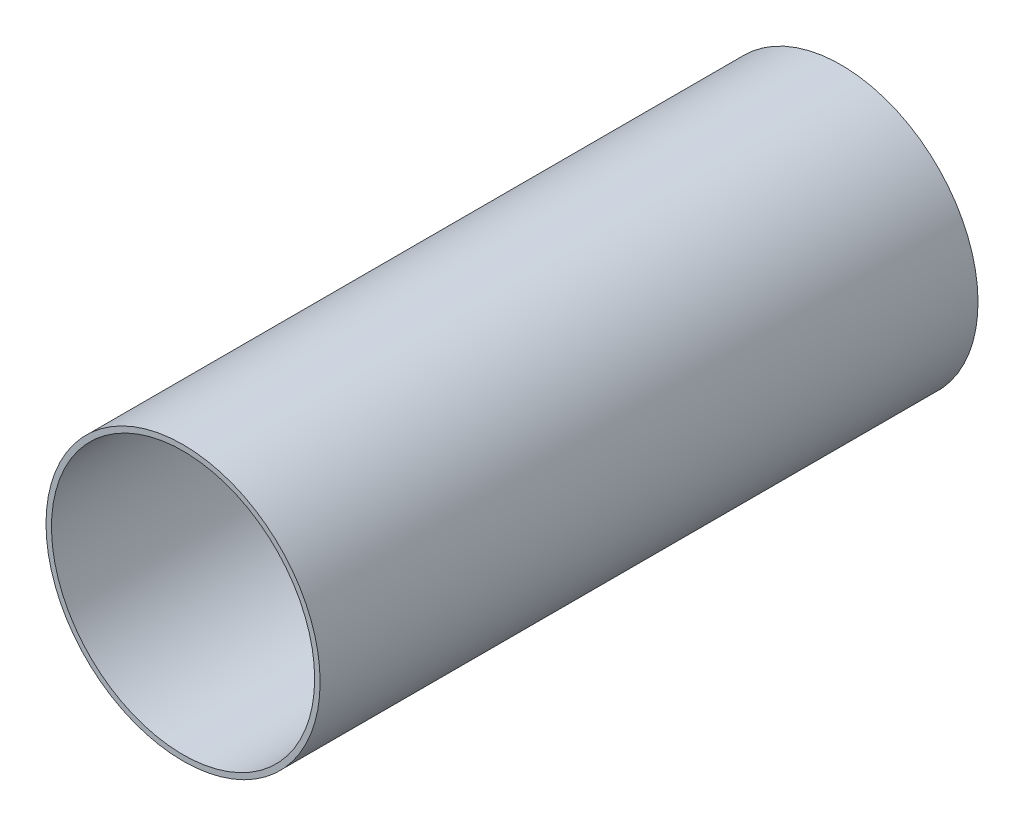
ISO-10303-21;
HEADER;
FILE_DESCRIPTION(('STEP AP214'),'2;1');
FILE_NAME('part.step','',(''),(''),'','','');
FILE_SCHEMA(('AUTOMOTIVE_DESIGN { 1 0 10303 214 1 1 1 1 }'));
ENDSEC;
DATA;
#1=APPLICATION_CONTEXT('core data for automotive mechanical design processes');
#2=APPLICATION_PROTOCOL_DEFINITION('international standard','automotive_design',2000,#1);
#3=PRODUCT_CONTEXT('',#1,'mechanical');
#4=PRODUCT('Part','Part','',(#3));
#5=PRODUCT_RELATED_PRODUCT_CATEGORY('part','',(#4));
#6=PRODUCT_DEFINITION_FORMATION('','',#4);
#7=PRODUCT_DEFINITION_CONTEXT('part definition',#1,'design');
#8=PRODUCT_DEFINITION('design','',#6,#7);
#9=PRODUCT_DEFINITION_SHAPE('','',#8);
#10=(LENGTH_UNIT() NAMED_UNIT(*) SI_UNIT(.MILLI.,.METRE.));
#11=(NAMED_UNIT(*) PLANE_ANGLE_UNIT() SI_UNIT($,.RADIAN.));
#12=(NAMED_UNIT(*) SI_UNIT($,.STERADIAN.) SOLID_ANGLE_UNIT());
#13=UNCERTAINTY_MEASURE_WITH_UNIT(LENGTH_MEASURE(1.E-05),#10,'distance_accuracy_value','');
#14=(GEOMETRIC_REPRESENTATION_CONTEXT(3) GLOBAL_UNCERTAINTY_ASSIGNED_CONTEXT((#13)) GLOBAL_UNIT_ASSIGNED_CONTEXT((#10,
#11,#12)) REPRESENTATION_CONTEXT('',''));
#15=CARTESIAN_POINT('',(0.,0.,0.));
#16=DIRECTION('',(0.,0.,1.));
#17=DIRECTION('',(1.,0.,0.));
#18=AXIS2_PLACEMENT_3D('',#15,#16,#17);
#19=CARTESIAN_POINT('',(0.,0.,120.));
#20=DIRECTION('',(0.,0.,1.));
#21=DIRECTION('',(1.,0.,0.));
#22=AXIS2_PLACEMENT_3D('',#19,#20,#21);
#23=PLANE('',#22);
#24=CARTESIAN_POINT('',(0.,0.,120.));
#25=DIRECTION('',(0.,0.,1.));
#26=DIRECTION('',(1.,0.,0.));
#27=AXIS2_PLACEMENT_3D('',#24,#25,#26);
#28=CIRCLE('',#27,25.);
#29=CARTESIAN_POINT('',(25.,0.,120.));
#30=VERTEX_POINT('',#29);
#31=EDGE_CURVE('E103',#30,#30,#28,.T.);
#32=ORIENTED_EDGE('',*,*,#31,.T.);
#33=EDGE_LOOP('',(#32));
#34=FACE_BOUND('',#33,.T.);
#35=CARTESIAN_POINT('',(0.,0.,120.));
#36=DIRECTION('',(0.,0.,1.));
#37=DIRECTION('',(1.,0.,0.));
#38=AXIS2_PLACEMENT_3D('',#35,#36,#37);
#39=CIRCLE('',#38,24.);
#40=CARTESIAN_POINT('',(24.,0.,120.));
#41=VERTEX_POINT('',#40);
#42=EDGE_CURVE('E97',#41,#41,#39,.T.);
#43=ORIENTED_EDGE('',*,*,#42,.F.);
#44=EDGE_LOOP('',(#43));
#45=FACE_BOUND('',#44,.T.);
#46=ADVANCED_FACE('F39',(#34,#45),#23,.T.);
#47=CARTESIAN_POINT('',(0.,0.,0.));
#48=DIRECTION('',(0.,0.,1.));
#49=DIRECTION('',(1.,0.,0.));
#50=AXIS2_PLACEMENT_3D('',#47,#48,#49);
#51=PLANE('',#50);
#52=CARTESIAN_POINT('',(0.,0.,0.));
#53=DIRECTION('',(0.,0.,1.));
#54=DIRECTION('',(1.,0.,0.));
#55=AXIS2_PLACEMENT_3D('',#52,#53,#54);
#56=CIRCLE('',#55,24.);
#57=CARTESIAN_POINT('',(15.,-18.7349939951952,0.));
#58=VERTEX_POINT('',#57);
#59=CARTESIAN_POINT('',(-15.,-18.7349939951952,0.));
#60=VERTEX_POINT('',#59);
#61=EDGE_CURVE('E94',#58,#60,#56,.T.);
#62=ORIENTED_EDGE('',*,*,#61,.T.);
#63=DIRECTION('',(0.,1.,0.));
#64=VECTOR('',#63,1.);
#65=CARTESIAN_POINT('',(-15.,-25.,0.));
#66=LINE('',#65,#64);
#67=CARTESIAN_POINT('',(-15.,-20.,0.));
#68=VERTEX_POINT('',#67);
#69=EDGE_CURVE('E60',#68,#60,#66,.T.);
#70=ORIENTED_EDGE('',*,*,#69,.F.);
#71=CARTESIAN_POINT('',(0.,0.,0.));
#72=DIRECTION('',(0.,0.,1.));
#73=DIRECTION('',(1.,0.,0.));
#74=AXIS2_PLACEMENT_3D('',#71,#72,#73);
#75=CIRCLE('',#74,25.);
#76=CARTESIAN_POINT('',(15.,-20.,0.));
#77=VERTEX_POINT('',#76);
#78=EDGE_CURVE('E93',#77,#68,#75,.T.);
#79=ORIENTED_EDGE('',*,*,#78,.F.);
#80=DIRECTION('',(0.,1.,0.));
#81=VECTOR('',#80,1.);
#82=CARTESIAN_POINT('',(15.,-25.,0.));
#83=LINE('',#82,#81);
#84=EDGE_CURVE('E112',#77,#58,#83,.T.);
#85=ORIENTED_EDGE('',*,*,#84,.T.);
#86=EDGE_LOOP('',(#62,#70,#79,#85));
#87=FACE_BOUND('',#86,.T.);
#88=ADVANCED_FACE('F116',(#87),#51,.F.);
#89=CARTESIAN_POINT('',(0.,0.,120.));
#90=DIRECTION('',(0.,0.,-1.));
#91=DIRECTION('',(-1.,0.,0.));
#92=AXIS2_PLACEMENT_3D('',#89,#90,#91);
#93=CYLINDRICAL_SURFACE('',#92,25.);
#94=ORIENTED_EDGE('',*,*,#31,.F.);
#95=EDGE_LOOP('',(#94));
#96=FACE_BOUND('',#95,.T.);
#97=ORIENTED_EDGE('',*,*,#78,.T.);
#98=DIRECTION('',(0.,0.,-1.));
#99=VECTOR('',#98,1.);
#100=CARTESIAN_POINT('',(-15.,-20.,120.));
#101=LINE('',#100,#99);
#102=CARTESIAN_POINT('',(-15.,-20.,40.));
#103=VERTEX_POINT('',#102);
#104=EDGE_CURVE('E88',#68,#103,#101,.F.);
#105=ORIENTED_EDGE('',*,*,#104,.T.);
#106=CARTESIAN_POINT('',(0.,0.,40.));
#107=DIRECTION('',(0.,0.,1.));
#108=DIRECTION('',(1.,0.,0.));
#109=AXIS2_PLACEMENT_3D('',#106,#107,#108);
#110=CIRCLE('',#109,25.);
#111=CARTESIAN_POINT('',(15.,-20.,40.));
#112=VERTEX_POINT('',#111);
#113=EDGE_CURVE('E77',#103,#112,#110,.T.);
#114=ORIENTED_EDGE('',*,*,#113,.T.);
#115=DIRECTION('',(0.,0.,-1.));
#116=VECTOR('',#115,1.);
#117=CARTESIAN_POINT('',(15.,-20.,120.));
#118=LINE('',#117,#116);
#119=EDGE_CURVE('E85',#112,#77,#118,.T.);
#120=ORIENTED_EDGE('',*,*,#119,.T.);
#121=EDGE_LOOP('',(#97,#105,#114,#120));
#122=FACE_BOUND('',#121,.T.);
#123=ADVANCED_FACE('F41',(#96,#122),#93,.T.);
#124=CARTESIAN_POINT('',(0.,0.,120.));
#125=DIRECTION('',(0.,0.,-1.));
#126=DIRECTION('',(-1.,0.,0.));
#127=AXIS2_PLACEMENT_3D('',#124,#125,#126);
#128=CYLINDRICAL_SURFACE('',#127,24.);
#129=DIRECTION('',(0.,0.,-1.));
#130=VECTOR('',#129,1.);
#131=CARTESIAN_POINT('',(-15.,-18.7349939951952,120.));
#132=LINE('',#131,#130);
#133=CARTESIAN_POINT('',(-15.,-18.7349939951952,40.));
#134=VERTEX_POINT('',#133);
#135=EDGE_CURVE('E12',#60,#134,#132,.F.);
#136=ORIENTED_EDGE('',*,*,#135,.F.);
#137=ORIENTED_EDGE('',*,*,#61,.F.);
#138=DIRECTION('',(0.,0.,-1.));
#139=VECTOR('',#138,1.);
#140=CARTESIAN_POINT('',(15.,-18.7349939951952,120.));
#141=LINE('',#140,#139);
#142=CARTESIAN_POINT('',(15.,-18.7349939951952,40.));
#143=VERTEX_POINT('',#142);
#144=EDGE_CURVE('E47',#143,#58,#141,.T.);
#145=ORIENTED_EDGE('',*,*,#144,.F.);
#146=CARTESIAN_POINT('',(0.,0.,40.));
#147=DIRECTION('',(0.,0.,1.));
#148=DIRECTION('',(1.,0.,0.));
#149=AXIS2_PLACEMENT_3D('',#146,#147,#148);
#150=CIRCLE('',#149,24.);
#151=EDGE_CURVE('E106',#134,#143,#150,.T.);
#152=ORIENTED_EDGE('',*,*,#151,.F.);
#153=EDGE_LOOP('',(#136,#137,#145,#152));
#154=FACE_BOUND('',#153,.T.);
#155=ORIENTED_EDGE('',*,*,#42,.T.);
#156=EDGE_LOOP('',(#155));
#157=FACE_BOUND('',#156,.T.);
#158=ADVANCED_FACE('F118',(#154,#157),#128,.F.);
#159=CARTESIAN_POINT('',(-15.,-25.,0.));
#160=DIRECTION('',(-1.,0.,0.));
#161=DIRECTION('',(0.,0.,1.));
#162=AXIS2_PLACEMENT_3D('',#159,#160,#161);
#163=PLANE('',#162);
#164=ORIENTED_EDGE('',*,*,#69,.T.);
#165=ORIENTED_EDGE('',*,*,#135,.T.);
#166=DIRECTION('',(0.,1.,0.));
#167=VECTOR('',#166,1.);
#168=CARTESIAN_POINT('',(-15.,-25.,40.));
#169=LINE('',#168,#167);
#170=EDGE_CURVE('E54',#103,#134,#169,.T.);
#171=ORIENTED_EDGE('',*,*,#170,.F.);
#172=ORIENTED_EDGE('',*,*,#104,.F.);
#173=EDGE_LOOP('',(#164,#165,#171,#172));
#174=FACE_BOUND('',#173,.T.);
#175=ADVANCED_FACE('F87',(#174),#163,.F.);
#176=CARTESIAN_POINT('',(15.,-25.,0.));
#177=DIRECTION('',(1.,0.,0.));
#178=DIRECTION('',(0.,0.,-1.));
#179=AXIS2_PLACEMENT_3D('',#176,#177,#178);
#180=PLANE('',#179);
#181=DIRECTION('',(0.,1.,0.));
#182=VECTOR('',#181,1.);
#183=CARTESIAN_POINT('',(15.,-25.,40.));
#184=LINE('',#183,#182);
#185=EDGE_CURVE('E80',#112,#143,#184,.T.);
#186=ORIENTED_EDGE('',*,*,#185,.T.);
#187=ORIENTED_EDGE('',*,*,#144,.T.);
#188=ORIENTED_EDGE('',*,*,#84,.F.);
#189=ORIENTED_EDGE('',*,*,#119,.F.);
#190=EDGE_LOOP('',(#186,#187,#188,#189));
#191=FACE_BOUND('',#190,.T.);
#192=ADVANCED_FACE('F111',(#191),#180,.F.);
#193=CARTESIAN_POINT('',(-15.,-25.,40.));
#194=DIRECTION('',(0.,0.,1.));
#195=DIRECTION('',(1.,0.,0.));
#196=AXIS2_PLACEMENT_3D('',#193,#194,#195);
#197=PLANE('',#196);
#198=ORIENTED_EDGE('',*,*,#170,.T.);
#199=ORIENTED_EDGE('',*,*,#151,.T.);
#200=ORIENTED_EDGE('',*,*,#185,.F.);
#201=ORIENTED_EDGE('',*,*,#113,.F.);
#202=EDGE_LOOP('',(#198,#199,#200,#201));
#203=FACE_BOUND('',#202,.T.);
#204=ADVANCED_FACE('F78',(#203),#197,.F.);
#205=CLOSED_SHELL('',(#46,#88,#123,#158,#175,#192,#204));
#206=MANIFOLD_SOLID_BREP('B2',#205);
#207=ADVANCED_BREP_SHAPE_REPRESENTATION('',(#18,#206),#14);
#208=SHAPE_DEFINITION_REPRESENTATION(#9,#207);
ENDSEC;
END-ISO-10303-21;
